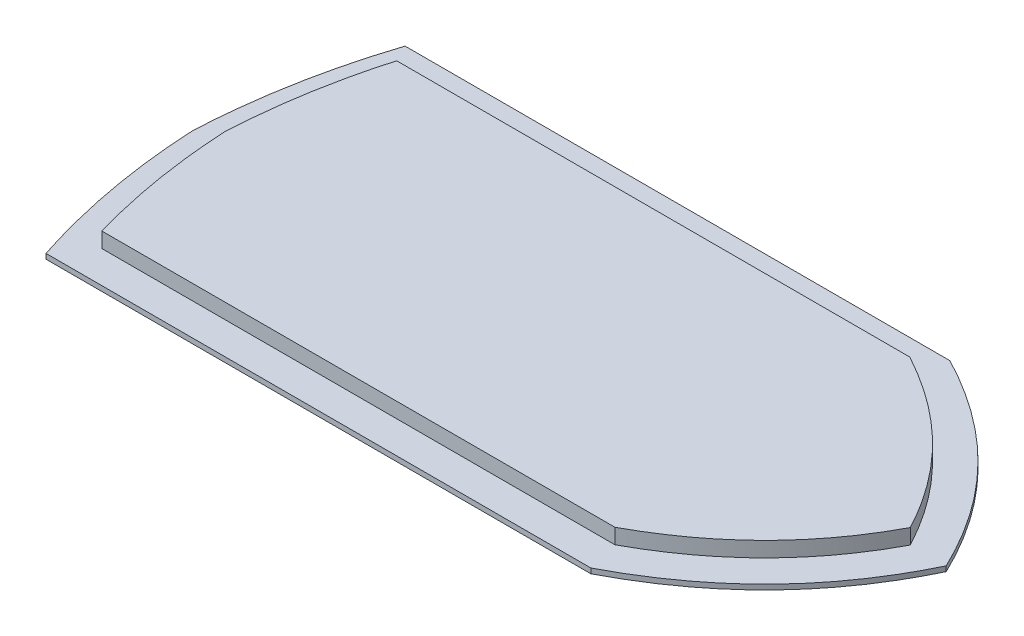
ISO-10303-21;
HEADER;
FILE_DESCRIPTION(('STEP AP214'),'2;1');
FILE_NAME('part.step','',(''),(''),'','','');
FILE_SCHEMA(('AUTOMOTIVE_DESIGN { 1 0 10303 214 1 1 1 1 }'));
ENDSEC;
DATA;
#1=APPLICATION_CONTEXT('core data for automotive mechanical design processes');
#2=APPLICATION_PROTOCOL_DEFINITION('international standard','automotive_design',2000,#1);
#3=PRODUCT_CONTEXT('',#1,'mechanical');
#4=PRODUCT('Part','Part','',(#3));
#5=PRODUCT_RELATED_PRODUCT_CATEGORY('part','',(#4));
#6=PRODUCT_DEFINITION_FORMATION('','',#4);
#7=PRODUCT_DEFINITION_CONTEXT('part definition',#1,'design');
#8=PRODUCT_DEFINITION('design','',#6,#7);
#9=PRODUCT_DEFINITION_SHAPE('','',#8);
#10=(LENGTH_UNIT() NAMED_UNIT(*) SI_UNIT(.MILLI.,.METRE.));
#11=(NAMED_UNIT(*) PLANE_ANGLE_UNIT() SI_UNIT($,.RADIAN.));
#12=(NAMED_UNIT(*) SI_UNIT($,.STERADIAN.) SOLID_ANGLE_UNIT());
#13=UNCERTAINTY_MEASURE_WITH_UNIT(LENGTH_MEASURE(1.E-05),#10,'distance_accuracy_value','');
#14=(GEOMETRIC_REPRESENTATION_CONTEXT(3) GLOBAL_UNCERTAINTY_ASSIGNED_CONTEXT((#13)) GLOBAL_UNIT_ASSIGNED_CONTEXT((#10,
#11,#12)) REPRESENTATION_CONTEXT('',''));
#15=CARTESIAN_POINT('',(0.,0.,0.));
#16=DIRECTION('',(0.,0.,1.));
#17=DIRECTION('',(1.,0.,0.));
#18=AXIS2_PLACEMENT_3D('',#15,#16,#17);
#19=CARTESIAN_POINT('',(73.5654257247831,1.,0.267750564302811));
#20=CARTESIAN_POINT('',(73.4731163843826,1.,0.0751853796585345));
#21=CARTESIAN_POINT('',(73.3802473030449,1.,-0.116700537833731));
#22=CARTESIAN_POINT('',(72.1214842014794,1.,-2.69297816917883));
#23=CARTESIAN_POINT('',(70.8719829150625,1.,-4.96718103937984));
#24=CARTESIAN_POINT('',(66.8796579469482,1.,-11.4694458963923));
#25=CARTESIAN_POINT('',(63.8892801854308,1.,-15.3929129981289));
#26=CARTESIAN_POINT('',(57.1582925777533,1.,-22.5926723987624));
#27=CARTESIAN_POINT('',(53.4166756456166,1.,-25.870159670778));
#28=CARTESIAN_POINT('',(47.1039402027856,1.,-30.372624463804));
#29=CARTESIAN_POINT('',(44.8796082874213,1.,-31.8054718423168));
#30=CARTESIAN_POINT('',(41.3630533944816,1.,-33.8440077064082));
#31=CARTESIAN_POINT('',(40.1634924245716,1.,-34.5036057788181));
#32=CARTESIAN_POINT('',(38.889937104615,1.,-35.1665257741676));
#33=CARTESIAN_POINT('',(38.8576245519135,1.,-35.1833212876915));
#34=CARTESIAN_POINT('',(38.8252812784857,1.,-35.2001087730377));
#35=B_SPLINE_CURVE_WITH_KNOTS('',3,(#19,#20,#21,#22,#23,#24,#25,#26,#27,#28,#29,#30,#31,#32,#33,
#34),.UNSPECIFIED.,.F.,.F.,(4,2,2,2,2,2,2,4),(0.132682557790047,0.142362352135894,
0.263088568572267,0.504541001445012,0.745993434317757,0.86671965075413,0.927082758972316,
0.928652581030893),.UNSPECIFIED.);
#36=DIRECTION('',(0.,-1.,0.));
#37=VECTOR('',#36,1.);
#38=SURFACE_OF_LINEAR_EXTRUSION('',#35,#37);
#39=CARTESIAN_POINT('',(73.5654257247831,0.,0.267750564302811));
#40=CARTESIAN_POINT('',(73.4731163843826,0.,0.0751853796585345));
#41=CARTESIAN_POINT('',(73.3802473030449,0.,-0.116700537833731));
#42=CARTESIAN_POINT('',(72.1214842014794,0.,-2.69297816917883));
#43=CARTESIAN_POINT('',(70.8719829150625,0.,-4.96718103937984));
#44=CARTESIAN_POINT('',(66.8796579469482,0.,-11.4694458963923));
#45=CARTESIAN_POINT('',(63.8892801854308,0.,-15.3929129981289));
#46=CARTESIAN_POINT('',(57.1582925777533,0.,-22.5926723987624));
#47=CARTESIAN_POINT('',(53.4166756456166,0.,-25.870159670778));
#48=CARTESIAN_POINT('',(47.1039402027856,0.,-30.372624463804));
#49=CARTESIAN_POINT('',(44.8796082874213,0.,-31.8054718423168));
#50=CARTESIAN_POINT('',(41.3630533944816,0.,-33.8440077064082));
#51=CARTESIAN_POINT('',(40.1634924245716,0.,-34.5036057788181));
#52=CARTESIAN_POINT('',(38.889937104615,0.,-35.1665257741676));
#53=CARTESIAN_POINT('',(38.8576245519135,0.,-35.1833212876915));
#54=CARTESIAN_POINT('',(38.8252812784857,0.,-35.2001087730377));
#55=B_SPLINE_CURVE_WITH_KNOTS('',3,(#39,#40,#41,#42,#43,#44,#45,#46,#47,#48,#49,#50,#51,#52,#53,
#54),.UNSPECIFIED.,.F.,.F.,(4,2,2,2,2,2,2,4),(0.132682557790047,0.142362352135894,
0.263088568572267,0.504541001445012,0.745993434317757,0.86671965075413,0.927082758972316,
0.928652581030893),.UNSPECIFIED.);
#56=CARTESIAN_POINT('',(73.5654257247831,0.,0.267750564302811));
#57=VERTEX_POINT('',#56);
#58=CARTESIAN_POINT('',(38.8252812784857,0.,-35.2001087730377));
#59=VERTEX_POINT('',#58);
#60=EDGE_CURVE('E135',#57,#59,#55,.T.);
#61=ORIENTED_EDGE('',*,*,#60,.T.);
#62=DIRECTION('',(0.,-1.,0.));
#63=VECTOR('',#62,1.);
#64=CARTESIAN_POINT('',(38.8252812784857,1.,-35.2001087730377));
#65=LINE('',#64,#63);
#66=CARTESIAN_POINT('',(38.8252812784857,1.,-35.2001087730377));
#67=VERTEX_POINT('',#66);
#68=EDGE_CURVE('E11',#67,#59,#65,.T.);
#69=ORIENTED_EDGE('',*,*,#68,.F.);
#70=CARTESIAN_POINT('',(73.5654257247831,1.,0.267750564302811));
#71=VERTEX_POINT('',#70);
#72=EDGE_CURVE('E164',#71,#67,#35,.T.);
#73=ORIENTED_EDGE('',*,*,#72,.F.);
#74=DIRECTION('',(0.,-1.,0.));
#75=VECTOR('',#74,1.);
#76=CARTESIAN_POINT('',(73.5654257247831,1.,0.267750564302811));
#77=LINE('',#76,#75);
#78=EDGE_CURVE('E125',#71,#57,#77,.T.);
#79=ORIENTED_EDGE('',*,*,#78,.T.);
#80=EDGE_LOOP('',(#61,#69,#73,#79));
#81=FACE_BOUND('',#80,.T.);
#82=ADVANCED_FACE('F33',(#81),#38,.F.);
#83=CARTESIAN_POINT('',(38.8252812784857,1.,-35.2001087730377));
#84=DIRECTION('',(0.,0.,1.));
#85=DIRECTION('',(1.,0.,0.));
#86=AXIS2_PLACEMENT_3D('',#83,#84,#85);
#87=PLANE('',#86);
#88=DIRECTION('',(-1.,0.,0.));
#89=VECTOR('',#88,1.);
#90=CARTESIAN_POINT('',(38.8252812784857,0.,-35.2001087730377));
#91=LINE('',#90,#89);
#92=CARTESIAN_POINT('',(-68.8075493930897,0.,-35.2001087730412));
#93=VERTEX_POINT('',#92);
#94=EDGE_CURVE('E416',#59,#93,#91,.T.);
#95=ORIENTED_EDGE('',*,*,#94,.T.);
#96=DIRECTION('',(0.,-1.,0.));
#97=VECTOR('',#96,1.);
#98=CARTESIAN_POINT('',(-68.8075493930897,1.,-35.2001087730412));
#99=LINE('',#98,#97);
#100=CARTESIAN_POINT('',(-68.8075493930897,1.,-35.2001087730412));
#101=VERTEX_POINT('',#100);
#102=EDGE_CURVE('E41',#101,#93,#99,.T.);
#103=ORIENTED_EDGE('',*,*,#102,.F.);
#104=DIRECTION('',(-1.,0.,0.));
#105=VECTOR('',#104,1.);
#106=CARTESIAN_POINT('',(38.8252812784857,1.,-35.2001087730377));
#107=LINE('',#106,#105);
#108=EDGE_CURVE('E92',#67,#101,#107,.T.);
#109=ORIENTED_EDGE('',*,*,#108,.F.);
#110=ORIENTED_EDGE('',*,*,#68,.T.);
#111=EDGE_LOOP('',(#95,#103,#109,#110));
#112=FACE_BOUND('',#111,.T.);
#113=ADVANCED_FACE('F155',(#112),#87,.F.);
#114=CARTESIAN_POINT('',(-68.8075493930897,1.,-35.2001087730412));
#115=CARTESIAN_POINT('',(-70.0802840457303,1.,-31.3029909507504));
#116=CARTESIAN_POINT('',(-71.169252334158,1.,-27.3748539588685));
#117=CARTESIAN_POINT('',(-72.9910458828833,1.,-19.4131966828434));
#118=CARTESIAN_POINT('',(-73.7212012843561,1.,-15.3770836851527));
#119=CARTESIAN_POINT('',(-74.5413412635863,1.,-9.25550878471135));
#120=CARTESIAN_POINT('',(-74.7686511183042,1.,-7.20545281521174));
#121=CARTESIAN_POINT('',(-75.1075813042149,1.,-3.34634985411257));
#122=CARTESIAN_POINT('',(-75.2306988435412,1.,-1.53887423163606));
#123=CARTESIAN_POINT('',(-75.3185930874104,1.,0.267750564515099));
#124=B_SPLINE_CURVE_WITH_KNOTS('',3,(#114,#115,#116,#117,#118,#119,#120,#121,#122,#123),
.UNSPECIFIED.,.F.,.F.,(4,2,2,2,4),(0.29050571687759,0.524524566985848,0.760550999434678,
0.878564215659093,0.980861336381922),.UNSPECIFIED.);
#125=DIRECTION('',(0.,-1.,0.));
#126=VECTOR('',#125,1.);
#127=SURFACE_OF_LINEAR_EXTRUSION('',#124,#126);
#128=CARTESIAN_POINT('',(-68.8075493930897,0.,-35.2001087730412));
#129=CARTESIAN_POINT('',(-70.0802840457303,0.,-31.3029909507504));
#130=CARTESIAN_POINT('',(-71.169252334158,0.,-27.3748539588685));
#131=CARTESIAN_POINT('',(-72.9910458828833,0.,-19.4131966828434));
#132=CARTESIAN_POINT('',(-73.7212012843561,0.,-15.3770836851527));
#133=CARTESIAN_POINT('',(-74.5413412635863,0.,-9.25550878471135));
#134=CARTESIAN_POINT('',(-74.7686511183042,0.,-7.20545281521174));
#135=CARTESIAN_POINT('',(-75.1075813042149,0.,-3.34634985411257));
#136=CARTESIAN_POINT('',(-75.2306988435412,0.,-1.53887423163606));
#137=CARTESIAN_POINT('',(-75.3185930874104,0.,0.267750564515099));
#138=B_SPLINE_CURVE_WITH_KNOTS('',3,(#128,#129,#130,#131,#132,#133,#134,#135,#136,#137),
.UNSPECIFIED.,.F.,.F.,(4,2,2,2,4),(0.29050571687759,0.524524566985848,0.760550999434678,
0.878564215659093,0.980861336381922),.UNSPECIFIED.);
#139=CARTESIAN_POINT('',(-75.3185930874104,0.,0.267750564515099));
#140=VERTEX_POINT('',#139);
#141=EDGE_CURVE('E417',#93,#140,#138,.T.);
#142=ORIENTED_EDGE('',*,*,#141,.T.);
#143=DIRECTION('',(0.,-1.,0.));
#144=VECTOR('',#143,1.);
#145=CARTESIAN_POINT('',(-75.3185930874104,1.,0.267750564515099));
#146=LINE('',#145,#144);
#147=CARTESIAN_POINT('',(-75.3185930874104,1.,0.267750564515099));
#148=VERTEX_POINT('',#147);
#149=EDGE_CURVE('E120',#148,#140,#146,.T.);
#150=ORIENTED_EDGE('',*,*,#149,.F.);
#151=EDGE_CURVE('E108',#101,#148,#124,.T.);
#152=ORIENTED_EDGE('',*,*,#151,.F.);
#153=ORIENTED_EDGE('',*,*,#102,.T.);
#154=EDGE_LOOP('',(#142,#150,#152,#153));
#155=FACE_BOUND('',#154,.T.);
#156=ADVANCED_FACE('F153',(#155),#127,.F.);
#157=CARTESIAN_POINT('',(-75.3185930874104,1.,0.267750564515088));
#158=CARTESIAN_POINT('',(-75.2306988435741,1.,2.07437536051846));
#159=CARTESIAN_POINT('',(-75.107581304203,1.,3.88185098284037));
#160=CARTESIAN_POINT('',(-74.7686511183054,1.,7.74095394379321));
#161=CARTESIAN_POINT('',(-74.5413412635874,1.,9.79100991328811));
#162=CARTESIAN_POINT('',(-73.7212012843574,1.,15.9125848137418));
#163=CARTESIAN_POINT('',(-72.9910458829119,1.,19.9486978112749));
#164=CARTESIAN_POINT('',(-71.1692523341329,1.,27.910355087597));
#165=CARTESIAN_POINT('',(-70.0802840456459,1.,31.8384920794212));
#166=CARTESIAN_POINT('',(-68.80754939309,1.,35.7356099016225));
#167=B_SPLINE_CURVE_WITH_KNOTS('',3,(#157,#158,#159,#160,#161,#162,#163,#164,#165,#166),
.UNSPECIFIED.,.F.,.F.,(4,2,2,2,4),(0.290505716877637,0.392802837592,0.510816053816415,
0.746842486265246,0.980861336373456),.UNSPECIFIED.);
#168=DIRECTION('',(0.,-1.,0.));
#169=VECTOR('',#168,1.);
#170=SURFACE_OF_LINEAR_EXTRUSION('',#167,#169);
#171=CARTESIAN_POINT('',(-75.3185930874104,0.,0.267750564515088));
#172=CARTESIAN_POINT('',(-75.2306988435741,0.,2.07437536051846));
#173=CARTESIAN_POINT('',(-75.107581304203,0.,3.88185098284037));
#174=CARTESIAN_POINT('',(-74.7686511183054,0.,7.74095394379321));
#175=CARTESIAN_POINT('',(-74.5413412635874,0.,9.79100991328811));
#176=CARTESIAN_POINT('',(-73.7212012843574,0.,15.9125848137418));
#177=CARTESIAN_POINT('',(-72.9910458829119,0.,19.9486978112749));
#178=CARTESIAN_POINT('',(-71.1692523341329,0.,27.910355087597));
#179=CARTESIAN_POINT('',(-70.0802840456459,0.,31.8384920794212));
#180=CARTESIAN_POINT('',(-68.80754939309,0.,35.7356099016225));
#181=B_SPLINE_CURVE_WITH_KNOTS('',3,(#171,#172,#173,#174,#175,#176,#177,#178,#179,#180),
.UNSPECIFIED.,.F.,.F.,(4,2,2,2,4),(0.290505716877637,0.392802837592,0.510816053816415,
0.746842486265246,0.980861336373456),.UNSPECIFIED.);
#182=CARTESIAN_POINT('',(-68.80754939309,0.,35.7356099016225));
#183=VERTEX_POINT('',#182);
#184=EDGE_CURVE('E117',#140,#183,#181,.T.);
#185=ORIENTED_EDGE('',*,*,#184,.T.);
#186=DIRECTION('',(0.,-1.,0.));
#187=VECTOR('',#186,1.);
#188=CARTESIAN_POINT('',(-68.80754939309,1.,35.7356099016225));
#189=LINE('',#188,#187);
#190=CARTESIAN_POINT('',(-68.80754939309,1.,35.7356099016225));
#191=VERTEX_POINT('',#190);
#192=EDGE_CURVE('E114',#191,#183,#189,.T.);
#193=ORIENTED_EDGE('',*,*,#192,.F.);
#194=EDGE_CURVE('E101',#148,#191,#167,.T.);
#195=ORIENTED_EDGE('',*,*,#194,.F.);
#196=ORIENTED_EDGE('',*,*,#149,.T.);
#197=EDGE_LOOP('',(#185,#193,#195,#196));
#198=FACE_BOUND('',#197,.T.);
#199=ADVANCED_FACE('F115',(#198),#170,.F.);
#200=CARTESIAN_POINT('',(-68.80754939309,1.,35.7356099016225));
#201=DIRECTION('',(0.,0.,-1.));
#202=DIRECTION('',(-1.,0.,0.));
#203=AXIS2_PLACEMENT_3D('',#200,#201,#202);
#204=PLANE('',#203);
#205=DIRECTION('',(1.,0.,0.));
#206=VECTOR('',#205,1.);
#207=CARTESIAN_POINT('',(-68.80754939309,0.,35.7356099016225));
#208=LINE('',#207,#206);
#209=CARTESIAN_POINT('',(38.8252812784885,0.,35.7356099016225));
#210=VERTEX_POINT('',#209);
#211=EDGE_CURVE('E429',#183,#210,#208,.T.);
#212=ORIENTED_EDGE('',*,*,#211,.T.);
#213=DIRECTION('',(0.,-1.,0.));
#214=VECTOR('',#213,1.);
#215=CARTESIAN_POINT('',(38.8252812784885,1.,35.7356099016225));
#216=LINE('',#215,#214);
#217=CARTESIAN_POINT('',(38.8252812784885,1.,35.7356099016225));
#218=VERTEX_POINT('',#217);
#219=EDGE_CURVE('E121',#218,#210,#216,.T.);
#220=ORIENTED_EDGE('',*,*,#219,.F.);
#221=DIRECTION('',(1.,0.,0.));
#222=VECTOR('',#221,1.);
#223=CARTESIAN_POINT('',(-68.80754939309,1.,35.7356099016225));
#224=LINE('',#223,#222);
#225=EDGE_CURVE('E105',#191,#218,#224,.T.);
#226=ORIENTED_EDGE('',*,*,#225,.F.);
#227=ORIENTED_EDGE('',*,*,#192,.T.);
#228=EDGE_LOOP('',(#212,#220,#226,#227));
#229=FACE_BOUND('',#228,.T.);
#230=ADVANCED_FACE('F123',(#229),#204,.F.);
#231=CARTESIAN_POINT('',(38.8252812784885,1.,35.7356099016225));
#232=CARTESIAN_POINT('',(38.8576245519165,1.,35.7188224162764));
#233=CARTESIAN_POINT('',(38.8899371046183,1.,35.7020269027526));
#234=CARTESIAN_POINT('',(40.163492424683,1.,35.0391069073561));
#235=CARTESIAN_POINT('',(41.3630533944193,1.,34.379508835042));
#236=CARTESIAN_POINT('',(44.8796082875566,1.,32.3409729708044));
#237=CARTESIAN_POINT('',(47.1039402029394,1.,30.9081255922852));
#238=CARTESIAN_POINT('',(53.4166756453181,1.,26.4056607995719));
#239=CARTESIAN_POINT('',(57.1582925779397,1.,23.1281735272762));
#240=CARTESIAN_POINT('',(63.889280185248,1.,15.928414126788));
#241=CARTESIAN_POINT('',(66.879657947023,1.,12.0049470247954));
#242=CARTESIAN_POINT('',(70.8719829150265,1.,5.50268216805977));
#243=CARTESIAN_POINT('',(72.1214842014385,1.,3.2284792977731));
#244=CARTESIAN_POINT('',(73.3802473030422,1.,0.652201666434904));
#245=CARTESIAN_POINT('',(73.4731163843805,1.,0.460315748947011));
#246=CARTESIAN_POINT('',(73.5654257247831,1.,0.267750564302811));
#247=B_SPLINE_CURVE_WITH_KNOTS('',3,(#231,#232,#233,#234,#235,#236,#237,#238,#239,#240,#241,
#242,#243,#244,#245,#246),.UNSPECIFIED.,.F.,.F.,(4,2,2,2,2,2,2,4),(0.13268255779072,
0.134252379849188,0.194615488067374,0.315341704503747,0.556794137376492,0.798246570249238,
0.91897278668561,0.928652581030785),.UNSPECIFIED.);
#248=DIRECTION('',(0.,-1.,0.));
#249=VECTOR('',#248,1.);
#250=SURFACE_OF_LINEAR_EXTRUSION('',#247,#249);
#251=CARTESIAN_POINT('',(38.8252812784885,0.,35.7356099016225));
#252=CARTESIAN_POINT('',(38.8576245519165,0.,35.7188224162764));
#253=CARTESIAN_POINT('',(38.8899371046183,0.,35.7020269027526));
#254=CARTESIAN_POINT('',(40.163492424683,0.,35.0391069073561));
#255=CARTESIAN_POINT('',(41.3630533944193,0.,34.379508835042));
#256=CARTESIAN_POINT('',(44.8796082875566,0.,32.3409729708044));
#257=CARTESIAN_POINT('',(47.1039402029394,0.,30.9081255922852));
#258=CARTESIAN_POINT('',(53.4166756453181,0.,26.4056607995719));
#259=CARTESIAN_POINT('',(57.1582925779397,0.,23.1281735272762));
#260=CARTESIAN_POINT('',(63.889280185248,0.,15.928414126788));
#261=CARTESIAN_POINT('',(66.879657947023,0.,12.0049470247954));
#262=CARTESIAN_POINT('',(70.8719829150265,0.,5.50268216805977));
#263=CARTESIAN_POINT('',(72.1214842014385,0.,3.2284792977731));
#264=CARTESIAN_POINT('',(73.3802473030422,0.,0.652201666434904));
#265=CARTESIAN_POINT('',(73.4731163843805,0.,0.460315748947011));
#266=CARTESIAN_POINT('',(73.5654257247831,0.,0.267750564302811));
#267=B_SPLINE_CURVE_WITH_KNOTS('',3,(#251,#252,#253,#254,#255,#256,#257,#258,#259,#260,#261,
#262,#263,#264,#265,#266),.UNSPECIFIED.,.F.,.F.,(4,2,2,2,2,2,2,4),(0.13268255779072,
0.134252379849188,0.194615488067374,0.315341704503747,0.556794137376492,0.798246570249238,
0.91897278668561,0.928652581030785),.UNSPECIFIED.);
#268=EDGE_CURVE('E84',#210,#57,#267,.T.);
#269=ORIENTED_EDGE('',*,*,#268,.T.);
#270=ORIENTED_EDGE('',*,*,#78,.F.);
#271=EDGE_CURVE('E57',#218,#71,#247,.T.);
#272=ORIENTED_EDGE('',*,*,#271,.F.);
#273=ORIENTED_EDGE('',*,*,#219,.T.);
#274=EDGE_LOOP('',(#269,#270,#272,#273));
#275=FACE_BOUND('',#274,.T.);
#276=ADVANCED_FACE('F143',(#275),#250,.F.);
#277=CARTESIAN_POINT('',(59.417961439061,1.,-20.1501116973961));
#278=DIRECTION('',(0.,-1.,0.));
#279=DIRECTION('',(0.,0.,-1.));
#280=AXIS2_PLACEMENT_3D('',#277,#278,#279);
#281=PLANE('',#280);
#282=CARTESIAN_POINT('',(66.4621065027831,1.,0.267750564274842));
#283=CARTESIAN_POINT('',(64.8186213848573,1.,-2.83893271351632));
#284=CARTESIAN_POINT('',(62.9757424085278,1.,-5.79998253887963));
#285=CARTESIAN_POINT('',(59.8860805575677,1.,-10.0039327032546));
#286=CARTESIAN_POINT('',(58.8017339902679,1.,-11.3654734077499));
#287=CARTESIAN_POINT('',(57.0916123615405,1.,-13.3467233283859));
#288=CARTESIAN_POINT('',(56.5076621739719,1.,-13.9969806307426));
#289=CARTESIAN_POINT('',(55.3119266423125,1.,-15.2771649706441));
#290=CARTESIAN_POINT('',(54.6989833923097,1.,-15.9082337080413));
#291=CARTESIAN_POINT('',(51.5781590027375,1.,-18.9970906699012));
#292=CARTESIAN_POINT('',(48.9144391342602,1.,-21.2423025842708));
#293=CARTESIAN_POINT('',(43.2924192176398,1.,-25.3344398106516));
#294=CARTESIAN_POINT('',(40.3350816492898,1.,-27.1826664417367));
#295=CARTESIAN_POINT('',(37.2476633820101,1.,-28.8550176976762));
#296=B_SPLINE_CURVE_WITH_KNOTS('',3,(#282,#283,#284,#285,#286,#287,#288,#289,#290,#291,#292,
#293,#294,#295),.UNSPECIFIED.,.F.,.F.,(4,2,2,2,2,2,4),(0.,0.249999999999999,0.374999999999999,
0.437499999999999,0.499999999999999,0.749999999999999,1.),.UNSPECIFIED.);
#297=CARTESIAN_POINT('',(66.4621065027831,1.,0.267750564274842));
#298=VERTEX_POINT('',#297);
#299=CARTESIAN_POINT('',(37.2476633820102,1.,-28.8550176976762));
#300=VERTEX_POINT('',#299);
#301=EDGE_CURVE('E177',#298,#300,#296,.T.);
#302=ORIENTED_EDGE('',*,*,#301,.F.);
#303=CARTESIAN_POINT('',(66.4621065027831,1.,0.267750564274842));
#304=CARTESIAN_POINT('',(64.8186213848642,1.,3.37443384207324));
#305=CARTESIAN_POINT('',(62.9757424085117,1.,6.33548366742298));
#306=CARTESIAN_POINT('',(59.8860805575266,1.,10.5394338317862));
#307=CARTESIAN_POINT('',(58.8017339902295,1.,11.900974536286));
#308=CARTESIAN_POINT('',(57.0916123615243,1.,13.8822244569423));
#309=CARTESIAN_POINT('',(56.5076621739659,1.,14.5324817593079));
#310=CARTESIAN_POINT('',(55.3119266423289,1.,15.8126660992289));
#311=CARTESIAN_POINT('',(54.6989833923284,1.,16.4437348366302));
#312=CARTESIAN_POINT('',(51.5781590027552,1.,19.5325917984874));
#313=CARTESIAN_POINT('',(48.9144391342579,1.,21.7778037128295));
#314=CARTESIAN_POINT('',(43.2924192176571,1.,25.8699409392366));
#315=CARTESIAN_POINT('',(40.3350816493102,1.,27.7181675703263));
#316=CARTESIAN_POINT('',(37.2476633820238,1.,29.3905188262576));
#317=B_SPLINE_CURVE_WITH_KNOTS('',3,(#303,#304,#305,#306,#307,#308,#309,#310,#311,#312,#313,
#314,#315,#316),.UNSPECIFIED.,.F.,.F.,(4,2,2,2,2,2,4),(0.,0.25,0.375,0.437500000000001,
0.500000000000001,0.75,1.),.UNSPECIFIED.);
#318=CARTESIAN_POINT('',(37.2476633820238,1.,29.3905188262576));
#319=VERTEX_POINT('',#318);
#320=EDGE_CURVE('E169',#298,#319,#317,.T.);
#321=ORIENTED_EDGE('',*,*,#320,.T.);
#322=DIRECTION('',(-1.,0.,0.));
#323=VECTOR('',#322,1.);
#324=CARTESIAN_POINT('',(59.417961439061,1.,29.3905188262576));
#325=LINE('',#324,#323);
#326=CARTESIAN_POINT('',(-64.1199699969539,1.,29.3905188262576));
#327=VERTEX_POINT('',#326);
#328=EDGE_CURVE('E204',#319,#327,#325,.T.);
#329=ORIENTED_EDGE('',*,*,#328,.T.);
#330=CARTESIAN_POINT('',(-64.1199699969539,1.,29.3905188262576));
#331=CARTESIAN_POINT('',(-65.4858257031966,1.,24.6463730513327));
#332=CARTESIAN_POINT('',(-66.5739367979542,1.,19.8388393424967));
#333=CARTESIAN_POINT('',(-68.1908095515751,1.,10.0988004736535));
#334=CARTESIAN_POINT('',(-68.714330818459,1.,5.19798640862925));
#335=CARTESIAN_POINT('',(-68.9656387400946,1.,0.267750564555903));
#336=B_SPLINE_CURVE_WITH_KNOTS('',3,(#330,#331,#332,#333,#334,#335),.UNSPECIFIED.,.F.,.F.,(4,2,
4),(0.,0.5,1.),.UNSPECIFIED.);
#337=CARTESIAN_POINT('',(-68.9656387400946,1.,0.267750564555903));
#338=VERTEX_POINT('',#337);
#339=EDGE_CURVE('E196',#327,#338,#336,.T.);
#340=ORIENTED_EDGE('',*,*,#339,.T.);
#341=CARTESIAN_POINT('',(-64.1199699969792,1.,-28.8550176976801));
#342=CARTESIAN_POINT('',(-65.4858257032339,1.,-24.1108719226669));
#343=CARTESIAN_POINT('',(-66.5739367979911,1.,-19.3033382137405));
#344=CARTESIAN_POINT('',(-68.1908095516193,1.,-9.56329934472032));
#345=CARTESIAN_POINT('',(-68.7143308184067,1.,-4.66248527959807));
#346=CARTESIAN_POINT('',(-68.9656387400946,1.,0.267750564555903));
#347=B_SPLINE_CURVE_WITH_KNOTS('',3,(#341,#342,#343,#344,#345,#346),.UNSPECIFIED.,.F.,.F.,(4,2,
4),(0.,0.5,1.),.UNSPECIFIED.);
#348=CARTESIAN_POINT('',(-64.1199699969792,1.,-28.8550176976801));
#349=VERTEX_POINT('',#348);
#350=EDGE_CURVE('E191',#349,#338,#347,.T.);
#351=ORIENTED_EDGE('',*,*,#350,.F.);
#352=DIRECTION('',(-1.,0.,0.));
#353=VECTOR('',#352,1.);
#354=CARTESIAN_POINT('',(59.4179614390613,1.,-28.8550176976754));
#355=LINE('',#354,#353);
#356=EDGE_CURVE('E185',#300,#349,#355,.T.);
#357=ORIENTED_EDGE('',*,*,#356,.F.);
#358=EDGE_LOOP('',(#302,#321,#329,#340,#351,#357));
#359=FACE_BOUND('',#358,.T.);
#360=ORIENTED_EDGE('',*,*,#72,.T.);
#361=ORIENTED_EDGE('',*,*,#108,.T.);
#362=ORIENTED_EDGE('',*,*,#151,.T.);
#363=ORIENTED_EDGE('',*,*,#194,.T.);
#364=ORIENTED_EDGE('',*,*,#225,.T.);
#365=ORIENTED_EDGE('',*,*,#271,.T.);
#366=EDGE_LOOP('',(#360,#361,#362,#363,#364,#365));
#367=FACE_BOUND('',#366,.T.);
#368=ADVANCED_FACE('F103',(#359,#367),#281,.F.);
#369=CARTESIAN_POINT('',(59.417961439061,0.,-20.1501116973961));
#370=DIRECTION('',(0.,-1.,0.));
#371=DIRECTION('',(0.,0.,-1.));
#372=AXIS2_PLACEMENT_3D('',#369,#370,#371);
#373=PLANE('',#372);
#374=ORIENTED_EDGE('',*,*,#60,.F.);
#375=ORIENTED_EDGE('',*,*,#268,.F.);
#376=ORIENTED_EDGE('',*,*,#211,.F.);
#377=ORIENTED_EDGE('',*,*,#184,.F.);
#378=ORIENTED_EDGE('',*,*,#141,.F.);
#379=ORIENTED_EDGE('',*,*,#94,.F.);
#380=EDGE_LOOP('',(#374,#375,#376,#377,#378,#379));
#381=FACE_BOUND('',#380,.T.);
#382=ADVANCED_FACE('F147',(#381),#373,.T.);
#383=CARTESIAN_POINT('',(66.4621065027831,4.,0.267750564274842));
#384=CARTESIAN_POINT('',(64.8186213848642,4.,3.37443384207324));
#385=CARTESIAN_POINT('',(62.9757424085117,4.,6.33548366742298));
#386=CARTESIAN_POINT('',(59.8860805575266,4.,10.5394338317862));
#387=CARTESIAN_POINT('',(58.8017339902295,4.,11.900974536286));
#388=CARTESIAN_POINT('',(57.0916123615243,4.,13.8822244569423));
#389=CARTESIAN_POINT('',(56.5076621739659,4.,14.5324817593079));
#390=CARTESIAN_POINT('',(55.3119266423289,4.,15.8126660992289));
#391=CARTESIAN_POINT('',(54.6989833923284,4.,16.4437348366302));
#392=CARTESIAN_POINT('',(51.5781590027552,4.,19.5325917984874));
#393=CARTESIAN_POINT('',(48.9144391342579,4.,21.7778037128295));
#394=CARTESIAN_POINT('',(43.2924192176571,4.,25.8699409392366));
#395=CARTESIAN_POINT('',(40.3350816493102,4.,27.7181675703263));
#396=CARTESIAN_POINT('',(37.2476633820238,4.,29.3905188262576));
#397=B_SPLINE_CURVE_WITH_KNOTS('',3,(#383,#384,#385,#386,#387,#388,#389,#390,#391,#392,#393,
#394,#395,#396),.UNSPECIFIED.,.F.,.F.,(4,2,2,2,2,2,4),(0.,0.25,0.375,0.437500000000001,
0.500000000000001,0.75,1.),.UNSPECIFIED.);
#398=DIRECTION('',(0.,-1.,0.));
#399=VECTOR('',#398,1.);
#400=SURFACE_OF_LINEAR_EXTRUSION('',#397,#399);
#401=ORIENTED_EDGE('',*,*,#320,.F.);
#402=DIRECTION('',(0.,-1.,0.));
#403=VECTOR('',#402,1.);
#404=CARTESIAN_POINT('',(66.4621065027831,4.,0.267750564274842));
#405=LINE('',#404,#403);
#406=CARTESIAN_POINT('',(66.4621065027831,4.,0.267750564274842));
#407=VERTEX_POINT('',#406);
#408=EDGE_CURVE('E210',#407,#298,#405,.T.);
#409=ORIENTED_EDGE('',*,*,#408,.F.);
#410=CARTESIAN_POINT('',(66.4621065027831,4.,0.267750564274842));
#411=CARTESIAN_POINT('',(64.8186213848642,4.,3.37443384207324));
#412=CARTESIAN_POINT('',(62.9757424085117,4.,6.33548366742298));
#413=CARTESIAN_POINT('',(59.8860805575266,4.,10.5394338317862));
#414=CARTESIAN_POINT('',(58.8017339902295,4.,11.900974536286));
#415=CARTESIAN_POINT('',(57.0916123615243,4.,13.8822244569423));
#416=CARTESIAN_POINT('',(56.5076621739659,4.,14.5324817593079));
#417=CARTESIAN_POINT('',(55.3119266423289,4.,15.8126660992289));
#418=CARTESIAN_POINT('',(54.6989833923284,4.,16.4437348366302));
#419=CARTESIAN_POINT('',(51.5781590027552,4.,19.5325917984874));
#420=CARTESIAN_POINT('',(48.9144391342579,4.,21.7778037128295));
#421=CARTESIAN_POINT('',(43.2924192176571,4.,25.8699409392366));
#422=CARTESIAN_POINT('',(40.3350816493102,4.,27.7181675703263));
#423=CARTESIAN_POINT('',(37.2476633820238,4.,29.3905188262576));
#424=B_SPLINE_CURVE_WITH_KNOTS('',3,(#410,#411,#412,#413,#414,#415,#416,#417,#418,#419,#420,
#421,#422,#423),.UNSPECIFIED.,.F.,.F.,(4,2,2,2,2,2,4),(0.,0.25,0.375,0.437500000000001,
0.500000000000001,0.75,1.),.UNSPECIFIED.);
#425=CARTESIAN_POINT('',(37.2476633820238,4.,29.3905188262576));
#426=VERTEX_POINT('',#425);
#427=EDGE_CURVE('E270',#407,#426,#424,.T.);
#428=ORIENTED_EDGE('',*,*,#427,.T.);
#429=DIRECTION('',(0.,-1.,0.));
#430=VECTOR('',#429,1.);
#431=CARTESIAN_POINT('',(37.2476633820238,4.,29.3905188262576));
#432=LINE('',#431,#430);
#433=EDGE_CURVE('E213',#426,#319,#432,.T.);
#434=ORIENTED_EDGE('',*,*,#433,.T.);
#435=EDGE_LOOP('',(#401,#409,#428,#434));
#436=FACE_BOUND('',#435,.T.);
#437=ADVANCED_FACE('F280',(#436),#400,.T.);
#438=CARTESIAN_POINT('',(66.4621065027831,4.,0.267750564274842));
#439=CARTESIAN_POINT('',(64.8186213848573,4.,-2.83893271351632));
#440=CARTESIAN_POINT('',(62.9757424085278,4.,-5.79998253887963));
#441=CARTESIAN_POINT('',(59.8860805575677,4.,-10.0039327032546));
#442=CARTESIAN_POINT('',(58.8017339902679,4.,-11.3654734077499));
#443=CARTESIAN_POINT('',(57.0916123615405,4.,-13.3467233283859));
#444=CARTESIAN_POINT('',(56.5076621739719,4.,-13.9969806307426));
#445=CARTESIAN_POINT('',(55.3119266423125,4.,-15.2771649706441));
#446=CARTESIAN_POINT('',(54.6989833923097,4.,-15.9082337080413));
#447=CARTESIAN_POINT('',(51.5781590027375,4.,-18.9970906699012));
#448=CARTESIAN_POINT('',(48.9144391342602,4.,-21.2423025842708));
#449=CARTESIAN_POINT('',(43.2924192176398,4.,-25.3344398106516));
#450=CARTESIAN_POINT('',(40.3350816492898,4.,-27.1826664417367));
#451=CARTESIAN_POINT('',(37.2476633820101,4.,-28.8550176976762));
#452=B_SPLINE_CURVE_WITH_KNOTS('',3,(#438,#439,#440,#441,#442,#443,#444,#445,#446,#447,#448,
#449,#450,#451),.UNSPECIFIED.,.F.,.F.,(4,2,2,2,2,2,4),(0.,0.249999999999999,0.374999999999999,
0.437499999999999,0.499999999999999,0.749999999999999,1.),.UNSPECIFIED.);
#453=DIRECTION('',(0.,-1.,0.));
#454=VECTOR('',#453,1.);
#455=SURFACE_OF_LINEAR_EXTRUSION('',#452,#454);
#456=ORIENTED_EDGE('',*,*,#408,.T.);
#457=ORIENTED_EDGE('',*,*,#301,.T.);
#458=DIRECTION('',(0.,-1.,0.));
#459=VECTOR('',#458,1.);
#460=CARTESIAN_POINT('',(37.2476633820102,4.,-28.8550176976762));
#461=LINE('',#460,#459);
#462=CARTESIAN_POINT('',(37.2476633820102,4.,-28.8550176976762));
#463=VERTEX_POINT('',#462);
#464=EDGE_CURVE('E335',#463,#300,#461,.T.);
#465=ORIENTED_EDGE('',*,*,#464,.F.);
#466=CARTESIAN_POINT('',(37.2476633820101,4.,-28.8550176976762));
#467=CARTESIAN_POINT('',(40.3350816492898,4.,-27.1826664417367));
#468=CARTESIAN_POINT('',(43.2924192176398,4.,-25.3344398106516));
#469=CARTESIAN_POINT('',(48.9144391342602,4.,-21.2423025842708));
#470=CARTESIAN_POINT('',(51.5781590027375,4.,-18.9970906699012));
#471=CARTESIAN_POINT('',(54.6989833923097,4.,-15.9082337080413));
#472=CARTESIAN_POINT('',(55.3119266423125,4.,-15.2771649706441));
#473=CARTESIAN_POINT('',(56.5076621739719,4.,-13.9969806307426));
#474=CARTESIAN_POINT('',(57.0916123615405,4.,-13.3467233283859));
#475=CARTESIAN_POINT('',(58.8017339902679,4.,-11.3654734077499));
#476=CARTESIAN_POINT('',(59.8860805575677,4.,-10.0039327032546));
#477=CARTESIAN_POINT('',(62.9757424085278,4.,-5.79998253887963));
#478=CARTESIAN_POINT('',(64.8186213848573,4.,-2.83893271351632));
#479=CARTESIAN_POINT('',(66.4621065027831,4.,0.267750564274842));
#480=B_SPLINE_CURVE_WITH_KNOTS('',3,(#466,#467,#468,#469,#470,#471,#472,#473,#474,#475,#476,
#477,#478,#479),.UNSPECIFIED.,.F.,.F.,(4,2,2,2,2,2,4),(0.,0.250000000000001,0.500000000000001,
0.562500000000001,0.625000000000001,0.750000000000001,1.),.UNSPECIFIED.);
#481=EDGE_CURVE('E216',#407,#463,#480,.F.);
#482=ORIENTED_EDGE('',*,*,#481,.F.);
#483=EDGE_LOOP('',(#456,#457,#465,#482));
#484=FACE_BOUND('',#483,.T.);
#485=ADVANCED_FACE('F234',(#484),#455,.F.);
#486=CARTESIAN_POINT('',(37.2476633820102,4.,-28.8550176976762));
#487=DIRECTION('',(0.,0.,1.));
#488=DIRECTION('',(1.,0.,0.));
#489=AXIS2_PLACEMENT_3D('',#486,#487,#488);
#490=PLANE('',#489);
#491=ORIENTED_EDGE('',*,*,#464,.T.);
#492=ORIENTED_EDGE('',*,*,#356,.T.);
#493=DIRECTION('',(0.,-1.,0.));
#494=VECTOR('',#493,1.);
#495=CARTESIAN_POINT('',(-64.1199699969792,4.,-28.8550176976801));
#496=LINE('',#495,#494);
#497=CARTESIAN_POINT('',(-64.1199699969792,4.,-28.8550176976801));
#498=VERTEX_POINT('',#497);
#499=EDGE_CURVE('E330',#498,#349,#496,.T.);
#500=ORIENTED_EDGE('',*,*,#499,.F.);
#501=DIRECTION('',(-1.,0.,0.));
#502=VECTOR('',#501,1.);
#503=CARTESIAN_POINT('',(37.2476633820102,4.,-28.8550176976762));
#504=LINE('',#503,#502);
#505=EDGE_CURVE('E355',#463,#498,#504,.T.);
#506=ORIENTED_EDGE('',*,*,#505,.F.);
#507=EDGE_LOOP('',(#491,#492,#500,#506));
#508=FACE_BOUND('',#507,.T.);
#509=ADVANCED_FACE('F400',(#508),#490,.F.);
#510=CARTESIAN_POINT('',(-64.1199699969792,4.,-28.8550176976801));
#511=CARTESIAN_POINT('',(-65.4858257032339,4.,-24.1108719226669));
#512=CARTESIAN_POINT('',(-66.5739367979911,4.,-19.3033382137405));
#513=CARTESIAN_POINT('',(-68.1908095516193,4.,-9.56329934472032));
#514=CARTESIAN_POINT('',(-68.7143308184067,4.,-4.66248527959807));
#515=CARTESIAN_POINT('',(-68.9656387400946,4.,0.267750564555903));
#516=B_SPLINE_CURVE_WITH_KNOTS('',3,(#510,#511,#512,#513,#514,#515),.UNSPECIFIED.,.F.,.F.,(4,2,
4),(0.,0.5,1.),.UNSPECIFIED.);
#517=DIRECTION('',(0.,-1.,0.));
#518=VECTOR('',#517,1.);
#519=SURFACE_OF_LINEAR_EXTRUSION('',#516,#518);
#520=ORIENTED_EDGE('',*,*,#499,.T.);
#521=ORIENTED_EDGE('',*,*,#350,.T.);
#522=DIRECTION('',(0.,-1.,0.));
#523=VECTOR('',#522,1.);
#524=CARTESIAN_POINT('',(-68.9656387400946,4.,0.267750564555903));
#525=LINE('',#524,#523);
#526=CARTESIAN_POINT('',(-68.9656387400946,4.,0.267750564555903));
#527=VERTEX_POINT('',#526);
#528=EDGE_CURVE('E264',#527,#338,#525,.T.);
#529=ORIENTED_EDGE('',*,*,#528,.F.);
#530=CARTESIAN_POINT('',(-68.9656387400946,4.,0.267750564555903));
#531=CARTESIAN_POINT('',(-68.7143308184067,4.,-4.66248527959807));
#532=CARTESIAN_POINT('',(-68.1908095516193,4.,-9.56329934472032));
#533=CARTESIAN_POINT('',(-66.5739367979911,4.,-19.3033382137405));
#534=CARTESIAN_POINT('',(-65.4858257032339,4.,-24.1108719226669));
#535=CARTESIAN_POINT('',(-64.1199699969792,4.,-28.8550176976801));
#536=B_SPLINE_CURVE_WITH_KNOTS('',3,(#530,#531,#532,#533,#534,#535),.UNSPECIFIED.,.F.,.F.,(4,2,
4),(0.,0.5,1.),.UNSPECIFIED.);
#537=EDGE_CURVE('E348',#498,#527,#536,.F.);
#538=ORIENTED_EDGE('',*,*,#537,.F.);
#539=EDGE_LOOP('',(#520,#521,#529,#538));
#540=FACE_BOUND('',#539,.T.);
#541=ADVANCED_FACE('F312',(#540),#519,.F.);
#542=CARTESIAN_POINT('',(-64.1199699969539,4.,29.3905188262576));
#543=CARTESIAN_POINT('',(-65.4858257031966,4.,24.6463730513327));
#544=CARTESIAN_POINT('',(-66.5739367979542,4.,19.8388393424967));
#545=CARTESIAN_POINT('',(-68.1908095515751,4.,10.0988004736535));
#546=CARTESIAN_POINT('',(-68.714330818459,4.,5.19798640862925));
#547=CARTESIAN_POINT('',(-68.9656387400946,4.,0.267750564555903));
#548=B_SPLINE_CURVE_WITH_KNOTS('',3,(#542,#543,#544,#545,#546,#547),.UNSPECIFIED.,.F.,.F.,(4,2,
4),(0.,0.5,1.),.UNSPECIFIED.);
#549=DIRECTION('',(0.,-1.,0.));
#550=VECTOR('',#549,1.);
#551=SURFACE_OF_LINEAR_EXTRUSION('',#548,#550);
#552=ORIENTED_EDGE('',*,*,#339,.F.);
#553=DIRECTION('',(0.,-1.,0.));
#554=VECTOR('',#553,1.);
#555=CARTESIAN_POINT('',(-64.1199699969539,4.,29.3905188262576));
#556=LINE('',#555,#554);
#557=CARTESIAN_POINT('',(-64.1199699969539,4.,29.3905188262576));
#558=VERTEX_POINT('',#557);
#559=EDGE_CURVE('E48',#558,#327,#556,.T.);
#560=ORIENTED_EDGE('',*,*,#559,.F.);
#561=CARTESIAN_POINT('',(-64.1199699969539,4.,29.3905188262576));
#562=CARTESIAN_POINT('',(-65.4858257031966,4.,24.6463730513327));
#563=CARTESIAN_POINT('',(-66.5739367979542,4.,19.8388393424967));
#564=CARTESIAN_POINT('',(-68.1908095515751,4.,10.0988004736535));
#565=CARTESIAN_POINT('',(-68.714330818459,4.,5.19798640862925));
#566=CARTESIAN_POINT('',(-68.9656387400946,4.,0.267750564555903));
#567=B_SPLINE_CURVE_WITH_KNOTS('',3,(#561,#562,#563,#564,#565,#566),.UNSPECIFIED.,.F.,.F.,(4,2,
4),(0.,0.5,1.),.UNSPECIFIED.);
#568=EDGE_CURVE('E269',#558,#527,#567,.T.);
#569=ORIENTED_EDGE('',*,*,#568,.T.);
#570=ORIENTED_EDGE('',*,*,#528,.T.);
#571=EDGE_LOOP('',(#552,#560,#569,#570));
#572=FACE_BOUND('',#571,.T.);
#573=ADVANCED_FACE('F308',(#572),#551,.T.);
#574=CARTESIAN_POINT('',(37.2476633820238,4.,29.3905188262576));
#575=DIRECTION('',(0.,0.,1.));
#576=DIRECTION('',(1.,0.,0.));
#577=AXIS2_PLACEMENT_3D('',#574,#575,#576);
#578=PLANE('',#577);
#579=ORIENTED_EDGE('',*,*,#328,.F.);
#580=ORIENTED_EDGE('',*,*,#433,.F.);
#581=DIRECTION('',(-1.,0.,0.));
#582=VECTOR('',#581,1.);
#583=CARTESIAN_POINT('',(37.2476633820238,4.,29.3905188262576));
#584=LINE('',#583,#582);
#585=EDGE_CURVE('E267',#426,#558,#584,.T.);
#586=ORIENTED_EDGE('',*,*,#585,.T.);
#587=ORIENTED_EDGE('',*,*,#559,.T.);
#588=EDGE_LOOP('',(#579,#580,#586,#587));
#589=FACE_BOUND('',#588,.T.);
#590=ADVANCED_FACE('F232',(#589),#578,.T.);
#591=CARTESIAN_POINT('',(54.0748185144138,4.,17.0615062290016));
#592=DIRECTION('',(0.,1.,0.));
#593=DIRECTION('',(0.,0.,1.));
#594=AXIS2_PLACEMENT_3D('',#591,#592,#593);
#595=PLANE('',#594);
#596=ORIENTED_EDGE('',*,*,#427,.F.);
#597=ORIENTED_EDGE('',*,*,#481,.T.);
#598=ORIENTED_EDGE('',*,*,#505,.T.);
#599=ORIENTED_EDGE('',*,*,#537,.T.);
#600=ORIENTED_EDGE('',*,*,#568,.F.);
#601=ORIENTED_EDGE('',*,*,#585,.F.);
#602=EDGE_LOOP('',(#596,#597,#598,#599,#600,#601));
#603=FACE_BOUND('',#602,.T.);
#604=ADVANCED_FACE('F223',(#603),#595,.T.);
#605=CLOSED_SHELL('',(#82,#113,#156,#199,#230,#276,#368,#382,#437,#485,#509,#541,#573,#590,#604));
#606=MANIFOLD_SOLID_BREP('B2',#605);
#607=ADVANCED_BREP_SHAPE_REPRESENTATION('',(#18,#606),#14);
#608=SHAPE_DEFINITION_REPRESENTATION(#9,#607);
ENDSEC;
END-ISO-10303-21;
